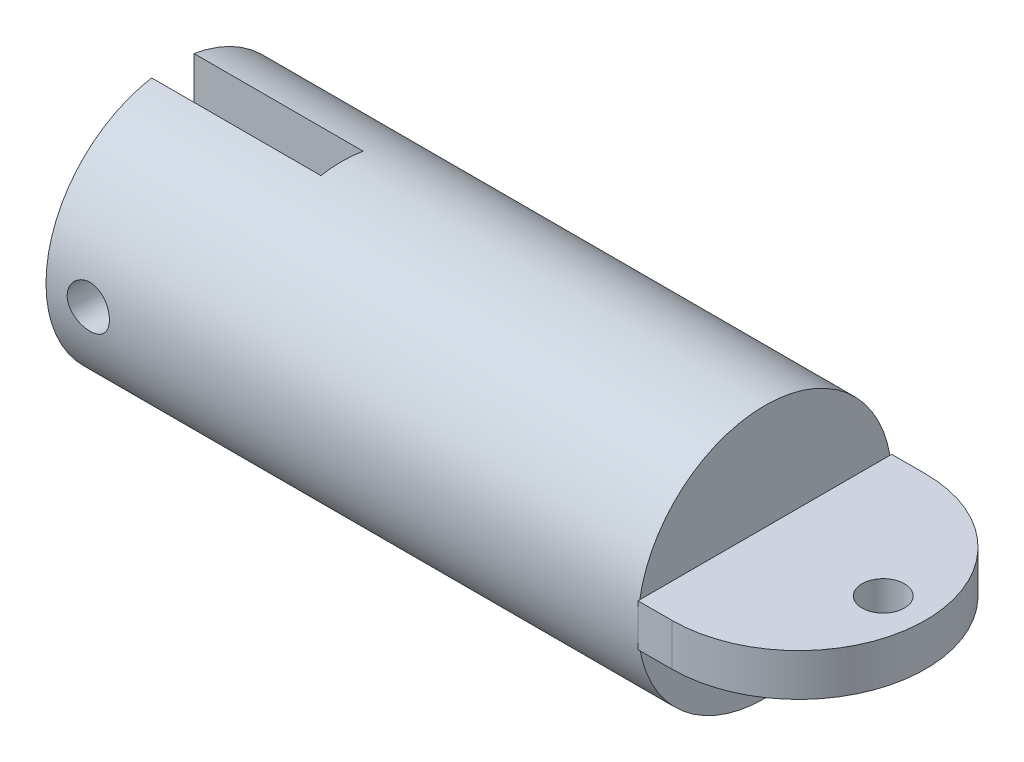
ISO-10303-21;
HEADER;
FILE_DESCRIPTION(('STEP AP214'),'2;1');
FILE_NAME('part.step','',(''),(''),'','','');
FILE_SCHEMA(('AUTOMOTIVE_DESIGN { 1 0 10303 214 1 1 1 1 }'));
ENDSEC;
DATA;
#1=APPLICATION_CONTEXT('core data for automotive mechanical design processes');
#2=APPLICATION_PROTOCOL_DEFINITION('international standard','automotive_design',2000,#1);
#3=PRODUCT_CONTEXT('',#1,'mechanical');
#4=PRODUCT('Part','Part','',(#3));
#5=PRODUCT_RELATED_PRODUCT_CATEGORY('part','',(#4));
#6=PRODUCT_DEFINITION_FORMATION('','',#4);
#7=PRODUCT_DEFINITION_CONTEXT('part definition',#1,'design');
#8=PRODUCT_DEFINITION('design','',#6,#7);
#9=PRODUCT_DEFINITION_SHAPE('','',#8);
#10=(LENGTH_UNIT() NAMED_UNIT(*) SI_UNIT(.MILLI.,.METRE.));
#11=(NAMED_UNIT(*) PLANE_ANGLE_UNIT() SI_UNIT($,.RADIAN.));
#12=(NAMED_UNIT(*) SI_UNIT($,.STERADIAN.) SOLID_ANGLE_UNIT());
#13=UNCERTAINTY_MEASURE_WITH_UNIT(LENGTH_MEASURE(1.E-05),#10,'distance_accuracy_value','');
#14=(GEOMETRIC_REPRESENTATION_CONTEXT(3) GLOBAL_UNCERTAINTY_ASSIGNED_CONTEXT((#13)) GLOBAL_UNIT_ASSIGNED_CONTEXT((#10,
#11,#12)) REPRESENTATION_CONTEXT('',''));
#15=CARTESIAN_POINT('',(0.,0.,0.));
#16=DIRECTION('',(0.,0.,1.));
#17=DIRECTION('',(1.,0.,0.));
#18=AXIS2_PLACEMENT_3D('',#15,#16,#17);
#19=CARTESIAN_POINT('',(0.,0.,0.));
#20=DIRECTION('',(1.,0.,0.));
#21=DIRECTION('',(0.,0.,-1.));
#22=AXIS2_PLACEMENT_3D('',#19,#20,#21);
#23=PLANE('',#22);
#24=DIRECTION('',(0.,0.,1.));
#25=VECTOR('',#24,1.);
#26=CARTESIAN_POINT('',(0.,2.5,15.));
#27=LINE('',#26,#25);
#28=CARTESIAN_POINT('',(0.,2.5,-14.790199457749));
#29=VERTEX_POINT('',#28);
#30=CARTESIAN_POINT('',(0.,2.5,14.790199457749));
#31=VERTEX_POINT('',#30);
#32=EDGE_CURVE('E11',#29,#31,#27,.T.);
#33=ORIENTED_EDGE('',*,*,#32,.F.);
#34=CARTESIAN_POINT('',(0.,0.,0.));
#35=DIRECTION('',(1.,0.,0.));
#36=DIRECTION('',(0.,0.,-1.));
#37=AXIS2_PLACEMENT_3D('',#34,#35,#36);
#38=CIRCLE('',#37,15.);
#39=EDGE_CURVE('E229',#29,#31,#38,.T.);
#40=ORIENTED_EDGE('',*,*,#39,.T.);
#41=EDGE_LOOP('',(#33,#40));
#42=FACE_BOUND('',#41,.T.);
#43=ADVANCED_FACE('F37',(#42),#23,.T.);
#44=CARTESIAN_POINT('',(-70.,0.,0.));
#45=DIRECTION('',(1.,0.,0.));
#46=DIRECTION('',(0.,0.,-1.));
#47=AXIS2_PLACEMENT_3D('',#44,#45,#46);
#48=PLANE('',#47);
#49=CARTESIAN_POINT('',(-70.,0.,0.));
#50=DIRECTION('',(1.,0.,0.));
#51=DIRECTION('',(0.,0.,-1.));
#52=AXIS2_PLACEMENT_3D('',#49,#50,#51);
#53=CIRCLE('',#52,15.);
#54=CARTESIAN_POINT('',(-70.,-14.790199457749,-2.5));
#55=VERTEX_POINT('',#54);
#56=CARTESIAN_POINT('',(-70.,14.790199457749,-2.5));
#57=VERTEX_POINT('',#56);
#58=EDGE_CURVE('E242',#55,#57,#53,.T.);
#59=ORIENTED_EDGE('',*,*,#58,.F.);
#60=DIRECTION('',(0.,1.,0.));
#61=VECTOR('',#60,1.);
#62=CARTESIAN_POINT('',(-70.,0.,-2.5));
#63=LINE('',#62,#61);
#64=EDGE_CURVE('E258',#55,#57,#63,.T.);
#65=ORIENTED_EDGE('',*,*,#64,.T.);
#66=EDGE_LOOP('',(#59,#65));
#67=FACE_BOUND('',#66,.T.);
#68=ADVANCED_FACE('F217',(#67),#48,.F.);
#69=CARTESIAN_POINT('',(-70.,0.,0.));
#70=DIRECTION('',(1.,0.,0.));
#71=DIRECTION('',(0.,0.,-1.));
#72=AXIS2_PLACEMENT_3D('',#69,#70,#71);
#73=CYLINDRICAL_SURFACE('',#72,15.);
#74=CARTESIAN_POINT('',(-62.5,0.,-15.));
#75=CARTESIAN_POINT('',(-62.5000055889478,-0.139390904958215,-14.9999976116882));
#76=CARTESIAN_POINT('',(-62.5116972749689,-0.278857881838821,-14.9980367791303));
#77=CARTESIAN_POINT('',(-62.5581356587653,-0.553880221673042,-14.9904034494139));
#78=CARTESIAN_POINT('',(-62.5929035569116,-0.689431867959245,-14.9847275392389));
#79=CARTESIAN_POINT('',(-62.6844154485928,-0.952604747212643,-14.9703006823645));
#80=CARTESIAN_POINT('',(-62.7411414656406,-1.0802323684319,-14.9615522515919));
#81=CARTESIAN_POINT('',(-62.8749122920524,-1.32414184197795,-14.9419422708207));
#82=CARTESIAN_POINT('',(-62.951954777483,-1.44042498987859,-14.9310809625443));
#83=CARTESIAN_POINT('',(-63.1249550838205,-1.65947261429168,-14.9083331745831));
#84=CARTESIAN_POINT('',(-63.2210691146361,-1.76211290353497,-14.8964387181486));
#85=CARTESIAN_POINT('',(-63.4291479684728,-1.94988849865993,-14.8730262687673));
#86=CARTESIAN_POINT('',(-63.5411137914566,-2.03502269939097,-14.8615082996267));
#87=CARTESIAN_POINT('',(-63.7785709661971,-2.18586712560513,-14.8400756575978));
#88=CARTESIAN_POINT('',(-63.9041413368047,-2.25145455286099,-14.8301712909164));
#89=CARTESIAN_POINT('',(-64.1647095643006,-2.36055836541121,-14.8131978979467));
#90=CARTESIAN_POINT('',(-64.2997067836776,-2.40407624156561,-14.8061286801431));
#91=CARTESIAN_POINT('',(-64.5739802748565,-2.4674143777848,-14.7957053684276));
#92=CARTESIAN_POINT('',(-64.7132057365014,-2.4874490291354,-14.792317684857));
#93=CARTESIAN_POINT('',(-64.9930802768835,-2.50391672528987,-14.7895393893665));
#94=CARTESIAN_POINT('',(-65.1337292541673,-2.50035144038899,-14.7901484945721));
#95=CARTESIAN_POINT('',(-65.4109278612755,-2.46989509839615,-14.7952642886356));
#96=CARTESIAN_POINT('',(-65.5475048035452,-2.44324488188977,-14.7997307331892));
#97=CARTESIAN_POINT('',(-65.8142213178291,-2.36775314040344,-14.8119949521101));
#98=CARTESIAN_POINT('',(-65.9443606688885,-2.31891085431974,-14.8197928407327));
#99=CARTESIAN_POINT('',(-66.1952288234409,-2.20017724609391,-14.837884793341));
#100=CARTESIAN_POINT('',(-66.3159094060812,-2.13018591387971,-14.8481906710733));
#101=CARTESIAN_POINT('',(-66.5439044005384,-1.97121201755744,-14.8701291841501));
#102=CARTESIAN_POINT('',(-66.6512177324549,-1.88222792065429,-14.8817619265429));
#103=CARTESIAN_POINT('',(-66.8508260858074,-1.68648221215905,-14.9052202787979));
#104=CARTESIAN_POINT('',(-66.9429185185401,-1.57951396387312,-14.9170464923165));
#105=CARTESIAN_POINT('',(-67.1078777626653,-1.35153524898164,-14.9394260139672));
#106=CARTESIAN_POINT('',(-67.1807444501832,-1.23052469190642,-14.9499793138975));
#107=CARTESIAN_POINT('',(-67.3052022271363,-0.977705916166705,-14.9686389289291));
#108=CARTESIAN_POINT('',(-67.3567754193313,-0.845888725564656,-14.9767431840745));
#109=CARTESIAN_POINT('',(-67.436994215246,-0.575298345602725,-14.9895750301266));
#110=CARTESIAN_POINT('',(-67.4656417369737,-0.43652573917946,-14.9943029035047));
#111=CARTESIAN_POINT('',(-67.4989213584611,-0.157709901301616,-14.9998112984269));
#112=CARTESIAN_POINT('',(-67.5038315718056,-0.017700737151005,-15.0006375301278));
#113=CARTESIAN_POINT('',(-67.4902386555719,0.261139772889892,-14.9983747442117));
#114=CARTESIAN_POINT('',(-67.4717364268663,0.399971163892043,-14.9952858772412));
#115=CARTESIAN_POINT('',(-67.4120751506645,0.671656175546764,-14.985568269382));
#116=CARTESIAN_POINT('',(-67.3710537916099,0.804540868385377,-14.9789610480131));
#117=CARTESIAN_POINT('',(-67.2676654818005,1.06154688486044,-14.9629446445536));
#118=CARTESIAN_POINT('',(-67.2052973323647,1.18566771590972,-14.9535353051202));
#119=CARTESIAN_POINT('',(-67.0603488753032,1.42283068946896,-14.9328451630241));
#120=CARTESIAN_POINT('',(-66.9775948438328,1.53576525093715,-14.9215485588702));
#121=CARTESIAN_POINT('',(-66.7944626846149,1.74624358550269,-14.898384673919));
#122=CARTESIAN_POINT('',(-66.6940832767233,1.84378623969658,-14.8865173517155));
#123=CARTESIAN_POINT('',(-66.4773024519286,2.021742779658,-14.8634017523585));
#124=CARTESIAN_POINT('',(-66.3607458344856,2.10196876111371,-14.8521611613711));
#125=CARTESIAN_POINT('',(-66.1156470308615,2.24170231029498,-14.8317152977788));
#126=CARTESIAN_POINT('',(-65.9871052247725,2.30121053476982,-14.8225099606602));
#127=CARTESIAN_POINT('',(-65.7222102671879,2.39753833147314,-14.807234536977));
#128=CARTESIAN_POINT('',(-65.5858919049695,2.43445143254794,-14.8011515431106));
#129=CARTESIAN_POINT('',(-65.3088798707782,2.48483545377827,-14.7927771683526));
#130=CARTESIAN_POINT('',(-65.1681865802679,2.49830841194616,-14.7904854578272));
#131=CARTESIAN_POINT('',(-64.8882948340376,2.50137286604735,-14.7899673308401));
#132=CARTESIAN_POINT('',(-64.7490996214247,2.49126013612518,-14.7916905650565));
#133=CARTESIAN_POINT('',(-64.4744207519492,2.44807983895684,-14.7988978145373));
#134=CARTESIAN_POINT('',(-64.3389370830581,2.41501234611247,-14.8043818176121));
#135=CARTESIAN_POINT('',(-64.0756415627074,2.32697448959489,-14.8184735628172));
#136=CARTESIAN_POINT('',(-63.947820989944,2.27202959060044,-14.8270776721967));
#137=CARTESIAN_POINT('',(-63.7031643308052,2.1418270039159,-14.8464436892221));
#138=CARTESIAN_POINT('',(-63.5863287896279,2.06656830874855,-14.857205703884));
#139=CARTESIAN_POINT('',(-63.3654644168922,1.89681888437215,-14.8798345404562));
#140=CARTESIAN_POINT('',(-63.2616039832997,1.80211056359364,-14.891712955763));
#141=CARTESIAN_POINT('',(-63.0711483955251,1.59660903138022,-14.9151437236084));
#142=CARTESIAN_POINT('',(-62.9845572313618,1.48581211291263,-14.9266960002655));
#143=CARTESIAN_POINT('',(-62.8305517318,1.25036916964028,-14.9482652964222));
#144=CARTESIAN_POINT('',(-62.7632739606871,1.12563278753281,-14.958271162531));
#145=CARTESIAN_POINT('',(-62.6507305153901,0.866513069378975,-14.9755116760178));
#146=CARTESIAN_POINT('',(-62.6054429189203,0.732139494830001,-14.9827490817748));
#147=CARTESIAN_POINT('',(-62.5479947258733,0.497703310045392,-14.9920579083296));
#148=CARTESIAN_POINT('',(-62.530025530384,0.399058830298441,-14.9950202727336));
#149=CARTESIAN_POINT('',(-62.5060262621552,0.200289310319806,-14.9989921598612));
#150=CARTESIAN_POINT('',(-62.4999959838626,0.100164295608492,-15.0000017162064));
#151=CARTESIAN_POINT('',(-62.5,0.,-15.));
#152=B_SPLINE_CURVE_WITH_KNOTS('',3,(#74,#75,#76,#77,#78,#79,#80,#81,#82,#83,#84,#85,#86,#87,
#88,#89,#90,#91,#92,#93,#94,#95,#96,#97,#98,#99,#100,#101,#102,#103,#104,#105,#106,#107,#108,
#109,#110,#111,#112,#113,#114,#115,#116,#117,#118,#119,#120,#121,#122,#123,#124,#125,#126,#127,
#128,#129,#130,#131,#132,#133,#134,#135,#136,#137,#138,#139,#140,#141,#142,#143,#144,#145,#146,
#147,#148,#149,#150,#151),.UNSPECIFIED.,.T.,.F.,(4,2,2,2,2,2,2,2,2,2,2,2,2,2,2,2,2,2,2,2,2,2,2,
2,2,2,2,2,2,2,2,2,2,2,2,2,2,2,4),(0.,0.417806584938509,0.835997545695422,1.25384686702527,
1.67164841267479,2.09302491062332,2.51442800169857,2.93842520823838,3.36239376876182,
3.78246077103422,4.20249804320885,4.61820521760407,5.0339266502538,5.45164556632556,
5.86939820680572,6.29232769911327,6.71525991635847,7.13854688915903,7.56179844521148,
7.98007883491396,8.39834313035859,8.81407807006414,9.22983635826065,9.64926825627023,
10.0687306305428,10.4925382200762,10.9163323737594,11.3383602234177,11.7603513778662,
12.177079095227,12.5938054618813,13.0100481822622,13.4263115502933,13.8475138419339,
14.2688133387897,14.693022316072,15.1168075213007,15.4170424816402,15.7172722727697),.UNSPECIFIED.);
#153=CARTESIAN_POINT('',(-62.5,0.,-15.));
#154=VERTEX_POINT('',#153);
#155=EDGE_CURVE('E185',#154,#154,#152,.T.);
#156=ORIENTED_EDGE('',*,*,#155,.F.);
#157=EDGE_LOOP('',(#156));
#158=FACE_BOUND('',#157,.T.);
#159=CARTESIAN_POINT('',(-62.5,0.,15.));
#160=CARTESIAN_POINT('',(-62.5000055889478,0.139390904958215,14.9999976116882));
#161=CARTESIAN_POINT('',(-62.5116972749689,0.278857881838821,14.9980367791303));
#162=CARTESIAN_POINT('',(-62.5581356587653,0.553880221673042,14.9904034494139));
#163=CARTESIAN_POINT('',(-62.5929035569116,0.689431867959245,14.9847275392389));
#164=CARTESIAN_POINT('',(-62.6844154485928,0.952604747212643,14.9703006823645));
#165=CARTESIAN_POINT('',(-62.7411414656406,1.0802323684319,14.9615522515919));
#166=CARTESIAN_POINT('',(-62.8749122920524,1.32414184197795,14.9419422708207));
#167=CARTESIAN_POINT('',(-62.951954777483,1.44042498987859,14.9310809625443));
#168=CARTESIAN_POINT('',(-63.1249550838205,1.65947261429168,14.9083331745831));
#169=CARTESIAN_POINT('',(-63.2210691146361,1.76211290353497,14.8964387181486));
#170=CARTESIAN_POINT('',(-63.4291479684728,1.94988849865993,14.8730262687673));
#171=CARTESIAN_POINT('',(-63.5411137914566,2.03502269939097,14.8615082996267));
#172=CARTESIAN_POINT('',(-63.7785709661971,2.18586712560513,14.8400756575978));
#173=CARTESIAN_POINT('',(-63.9041413368047,2.25145455286099,14.8301712909164));
#174=CARTESIAN_POINT('',(-64.1647095643006,2.36055836541121,14.8131978979467));
#175=CARTESIAN_POINT('',(-64.2997067836776,2.40407624156561,14.8061286801431));
#176=CARTESIAN_POINT('',(-64.5739802748565,2.4674143777848,14.7957053684276));
#177=CARTESIAN_POINT('',(-64.7132057365014,2.4874490291354,14.792317684857));
#178=CARTESIAN_POINT('',(-64.9930802768835,2.50391672528987,14.7895393893665));
#179=CARTESIAN_POINT('',(-65.1337292541673,2.50035144038899,14.7901484945721));
#180=CARTESIAN_POINT('',(-65.4109278612755,2.46989509839615,14.7952642886356));
#181=CARTESIAN_POINT('',(-65.5475048035452,2.44324488188977,14.7997307331892));
#182=CARTESIAN_POINT('',(-65.8142213178291,2.36775314040344,14.8119949521101));
#183=CARTESIAN_POINT('',(-65.9443606688885,2.31891085431974,14.8197928407327));
#184=CARTESIAN_POINT('',(-66.1952288234409,2.20017724609391,14.837884793341));
#185=CARTESIAN_POINT('',(-66.3159094060812,2.13018591387971,14.8481906710733));
#186=CARTESIAN_POINT('',(-66.5439044005384,1.97121201755744,14.8701291841501));
#187=CARTESIAN_POINT('',(-66.6512177324549,1.88222792065429,14.8817619265429));
#188=CARTESIAN_POINT('',(-66.8508260858074,1.68648221215905,14.9052202787979));
#189=CARTESIAN_POINT('',(-66.9429185185401,1.57951396387312,14.9170464923165));
#190=CARTESIAN_POINT('',(-67.1078777626653,1.35153524898164,14.9394260139672));
#191=CARTESIAN_POINT('',(-67.1807444501832,1.23052469190642,14.9499793138975));
#192=CARTESIAN_POINT('',(-67.3052022271363,0.977705916166705,14.9686389289291));
#193=CARTESIAN_POINT('',(-67.3567754193313,0.845888725564656,14.9767431840745));
#194=CARTESIAN_POINT('',(-67.436994215246,0.575298345602725,14.9895750301266));
#195=CARTESIAN_POINT('',(-67.4656417369737,0.43652573917946,14.9943029035047));
#196=CARTESIAN_POINT('',(-67.4989213584611,0.157709901301616,14.9998112984269));
#197=CARTESIAN_POINT('',(-67.5038315718056,0.017700737151005,15.0006375301278));
#198=CARTESIAN_POINT('',(-67.4902386555719,-0.261139772889892,14.9983747442117));
#199=CARTESIAN_POINT('',(-67.4717364268663,-0.399971163892043,14.9952858772412));
#200=CARTESIAN_POINT('',(-67.4120751506645,-0.671656175546764,14.985568269382));
#201=CARTESIAN_POINT('',(-67.3710537916099,-0.804540868385377,14.9789610480131));
#202=CARTESIAN_POINT('',(-67.2676654818005,-1.06154688486044,14.9629446445536));
#203=CARTESIAN_POINT('',(-67.2052973323647,-1.18566771590972,14.9535353051202));
#204=CARTESIAN_POINT('',(-67.0603488753032,-1.42283068946896,14.9328451630241));
#205=CARTESIAN_POINT('',(-66.9775948438328,-1.53576525093715,14.9215485588702));
#206=CARTESIAN_POINT('',(-66.7944626846149,-1.74624358550269,14.898384673919));
#207=CARTESIAN_POINT('',(-66.6940832767233,-1.84378623969658,14.8865173517155));
#208=CARTESIAN_POINT('',(-66.4773024519286,-2.021742779658,14.8634017523585));
#209=CARTESIAN_POINT('',(-66.3607458344856,-2.10196876111371,14.8521611613711));
#210=CARTESIAN_POINT('',(-66.1156470308615,-2.24170231029498,14.8317152977788));
#211=CARTESIAN_POINT('',(-65.9871052247725,-2.30121053476982,14.8225099606602));
#212=CARTESIAN_POINT('',(-65.7222102671879,-2.39753833147314,14.807234536977));
#213=CARTESIAN_POINT('',(-65.5858919049695,-2.43445143254794,14.8011515431106));
#214=CARTESIAN_POINT('',(-65.3088798707782,-2.48483545377827,14.7927771683526));
#215=CARTESIAN_POINT('',(-65.1681865802679,-2.49830841194616,14.7904854578272));
#216=CARTESIAN_POINT('',(-64.8882948340376,-2.50137286604735,14.7899673308401));
#217=CARTESIAN_POINT('',(-64.7490996214247,-2.49126013612518,14.7916905650565));
#218=CARTESIAN_POINT('',(-64.4744207519492,-2.44807983895684,14.7988978145373));
#219=CARTESIAN_POINT('',(-64.3389370830581,-2.41501234611247,14.8043818176121));
#220=CARTESIAN_POINT('',(-64.0756415627074,-2.32697448959489,14.8184735628172));
#221=CARTESIAN_POINT('',(-63.947820989944,-2.27202959060044,14.8270776721967));
#222=CARTESIAN_POINT('',(-63.7031643308052,-2.1418270039159,14.8464436892221));
#223=CARTESIAN_POINT('',(-63.5863287896279,-2.06656830874855,14.857205703884));
#224=CARTESIAN_POINT('',(-63.3654644168922,-1.89681888437215,14.8798345404562));
#225=CARTESIAN_POINT('',(-63.2616039832997,-1.80211056359364,14.891712955763));
#226=CARTESIAN_POINT('',(-63.0711483955251,-1.59660903138022,14.9151437236084));
#227=CARTESIAN_POINT('',(-62.9845572313618,-1.48581211291263,14.9266960002655));
#228=CARTESIAN_POINT('',(-62.8305517318,-1.25036916964028,14.9482652964222));
#229=CARTESIAN_POINT('',(-62.7632739606871,-1.12563278753281,14.958271162531));
#230=CARTESIAN_POINT('',(-62.6507305153901,-0.866513069378975,14.9755116760178));
#231=CARTESIAN_POINT('',(-62.6054429189203,-0.732139494830001,14.9827490817748));
#232=CARTESIAN_POINT('',(-62.5479947258733,-0.497703310045392,14.9920579083296));
#233=CARTESIAN_POINT('',(-62.530025530384,-0.399058830298441,14.9950202727336));
#234=CARTESIAN_POINT('',(-62.5060262621552,-0.200289310319806,14.9989921598612));
#235=CARTESIAN_POINT('',(-62.4999959838626,-0.100164295608492,15.0000017162064));
#236=CARTESIAN_POINT('',(-62.5,0.,15.));
#237=B_SPLINE_CURVE_WITH_KNOTS('',3,(#159,#160,#161,#162,#163,#164,#165,#166,#167,#168,#169,
#170,#171,#172,#173,#174,#175,#176,#177,#178,#179,#180,#181,#182,#183,#184,#185,#186,#187,#188,
#189,#190,#191,#192,#193,#194,#195,#196,#197,#198,#199,#200,#201,#202,#203,#204,#205,#206,#207,
#208,#209,#210,#211,#212,#213,#214,#215,#216,#217,#218,#219,#220,#221,#222,#223,#224,#225,#226,
#227,#228,#229,#230,#231,#232,#233,#234,#235,#236),.UNSPECIFIED.,.T.,.F.,(4,2,2,2,2,2,2,2,2,2,2,
2,2,2,2,2,2,2,2,2,2,2,2,2,2,2,2,2,2,2,2,2,2,2,2,2,2,2,4),(0.,0.417806584938509,
0.835997545695422,1.25384686702527,1.67164841267479,2.09302491062332,2.51442800169857,
2.93842520823838,3.36239376876182,3.78246077103422,4.20249804320885,4.61820521760407,
5.0339266502538,5.45164556632556,5.86939820680572,6.29232769911327,6.71525991635847,
7.13854688915903,7.56179844521148,7.98007883491396,8.39834313035859,8.81407807006414,
9.22983635826065,9.64926825627023,10.0687306305428,10.4925382200762,10.9163323737594,
11.3383602234177,11.7603513778662,12.177079095227,12.5938054618813,13.0100481822622,
13.4263115502933,13.8475138419339,14.2688133387897,14.693022316072,15.1168075213007,
15.4170424816402,15.7172722727697),.UNSPECIFIED.);
#238=CARTESIAN_POINT('',(-62.5,0.,15.));
#239=VERTEX_POINT('',#238);
#240=EDGE_CURVE('E178',#239,#239,#237,.T.);
#241=ORIENTED_EDGE('',*,*,#240,.F.);
#242=EDGE_LOOP('',(#241));
#243=FACE_BOUND('',#242,.T.);
#244=DIRECTION('',(1.,0.,0.));
#245=VECTOR('',#244,1.);
#246=CARTESIAN_POINT('',(-70.,-14.790199457749,-2.5));
#247=LINE('',#246,#245);
#248=CARTESIAN_POINT('',(-50.,-14.790199457749,-2.5));
#249=VERTEX_POINT('',#248);
#250=EDGE_CURVE('E280',#55,#249,#247,.T.);
#251=ORIENTED_EDGE('',*,*,#250,.F.);
#252=ORIENTED_EDGE('',*,*,#58,.T.);
#253=DIRECTION('',(1.,0.,0.));
#254=VECTOR('',#253,1.);
#255=CARTESIAN_POINT('',(-70.,14.790199457749,-2.5));
#256=LINE('',#255,#254);
#257=CARTESIAN_POINT('',(-50.,14.790199457749,-2.5));
#258=VERTEX_POINT('',#257);
#259=EDGE_CURVE('E287',#258,#57,#256,.F.);
#260=ORIENTED_EDGE('',*,*,#259,.F.);
#261=CARTESIAN_POINT('',(-50.,0.,0.));
#262=DIRECTION('',(1.,0.,0.));
#263=DIRECTION('',(0.,0.,-1.));
#264=AXIS2_PLACEMENT_3D('',#261,#262,#263);
#265=CIRCLE('',#264,15.);
#266=CARTESIAN_POINT('',(-50.,14.790199457749,2.5));
#267=VERTEX_POINT('',#266);
#268=EDGE_CURVE('E262',#267,#258,#265,.F.);
#269=ORIENTED_EDGE('',*,*,#268,.F.);
#270=DIRECTION('',(1.,0.,0.));
#271=VECTOR('',#270,1.);
#272=CARTESIAN_POINT('',(-70.,14.790199457749,2.5));
#273=LINE('',#272,#271);
#274=CARTESIAN_POINT('',(-70.,14.790199457749,2.5));
#275=VERTEX_POINT('',#274);
#276=EDGE_CURVE('E294',#275,#267,#273,.T.);
#277=ORIENTED_EDGE('',*,*,#276,.F.);
#278=CARTESIAN_POINT('',(-70.,-14.790199457749,2.5));
#279=VERTEX_POINT('',#278);
#280=EDGE_CURVE('E259',#275,#279,#53,.T.);
#281=ORIENTED_EDGE('',*,*,#280,.T.);
#282=DIRECTION('',(1.,0.,0.));
#283=VECTOR('',#282,1.);
#284=CARTESIAN_POINT('',(-70.,-14.790199457749,2.5));
#285=LINE('',#284,#283);
#286=CARTESIAN_POINT('',(-50.,-14.790199457749,2.5));
#287=VERTEX_POINT('',#286);
#288=EDGE_CURVE('E288',#287,#279,#285,.F.);
#289=ORIENTED_EDGE('',*,*,#288,.F.);
#290=EDGE_CURVE('E263',#249,#287,#265,.F.);
#291=ORIENTED_EDGE('',*,*,#290,.F.);
#292=EDGE_LOOP('',(#251,#252,#260,#269,#277,#281,#289,#291));
#293=FACE_BOUND('',#292,.T.);
#294=CARTESIAN_POINT('',(0.,0.,-15.));
#295=VERTEX_POINT('',#294);
#296=EDGE_CURVE('E234',#295,#29,#38,.T.);
#297=ORIENTED_EDGE('',*,*,#296,.F.);
#298=CARTESIAN_POINT('',(0.,-2.5,-14.790199457749));
#299=VERTEX_POINT('',#298);
#300=EDGE_CURVE('E243',#299,#295,#38,.T.);
#301=ORIENTED_EDGE('',*,*,#300,.F.);
#302=CARTESIAN_POINT('',(0.,-2.5,14.790199457749));
#303=VERTEX_POINT('',#302);
#304=EDGE_CURVE('E251',#303,#299,#38,.T.);
#305=ORIENTED_EDGE('',*,*,#304,.F.);
#306=CARTESIAN_POINT('',(0.,0.,15.));
#307=VERTEX_POINT('',#306);
#308=EDGE_CURVE('E62',#307,#303,#38,.T.);
#309=ORIENTED_EDGE('',*,*,#308,.F.);
#310=EDGE_CURVE('E236',#31,#307,#38,.T.);
#311=ORIENTED_EDGE('',*,*,#310,.F.);
#312=ORIENTED_EDGE('',*,*,#39,.F.);
#313=EDGE_LOOP('',(#297,#301,#305,#309,#311,#312));
#314=FACE_BOUND('',#313,.T.);
#315=ADVANCED_FACE('F39',(#158,#243,#293,#314),#73,.T.);
#316=ORIENTED_EDGE('',*,*,#280,.F.);
#317=DIRECTION('',(0.,-1.,0.));
#318=VECTOR('',#317,1.);
#319=CARTESIAN_POINT('',(-70.,0.,2.5));
#320=LINE('',#319,#318);
#321=EDGE_CURVE('E255',#275,#279,#320,.T.);
#322=ORIENTED_EDGE('',*,*,#321,.T.);
#323=EDGE_LOOP('',(#316,#322));
#324=FACE_BOUND('',#323,.T.);
#325=ADVANCED_FACE('F214',(#324),#48,.F.);
#326=DIRECTION('',(0.,0.,-1.));
#327=VECTOR('',#326,1.);
#328=CARTESIAN_POINT('',(0.,-2.5,15.));
#329=LINE('',#328,#327);
#330=EDGE_CURVE('E47',#303,#299,#329,.T.);
#331=ORIENTED_EDGE('',*,*,#330,.F.);
#332=ORIENTED_EDGE('',*,*,#304,.T.);
#333=EDGE_LOOP('',(#331,#332));
#334=FACE_BOUND('',#333,.T.);
#335=ADVANCED_FACE('F205',(#334),#23,.T.);
#336=CARTESIAN_POINT('',(-70.,-15.,-2.5));
#337=DIRECTION('',(0.,0.,-1.));
#338=DIRECTION('',(-1.,0.,0.));
#339=AXIS2_PLACEMENT_3D('',#336,#337,#338);
#340=PLANE('',#339);
#341=CARTESIAN_POINT('',(-65.,0.,-2.5));
#342=DIRECTION('',(0.,0.,-1.));
#343=DIRECTION('',(-1.,0.,0.));
#344=AXIS2_PLACEMENT_3D('',#341,#342,#343);
#345=CIRCLE('',#344,2.5);
#346=CARTESIAN_POINT('',(-67.5,0.,-2.5));
#347=VERTEX_POINT('',#346);
#348=EDGE_CURVE('E175',#347,#347,#345,.T.);
#349=ORIENTED_EDGE('',*,*,#348,.T.);
#350=EDGE_LOOP('',(#349));
#351=FACE_BOUND('',#350,.T.);
#352=ORIENTED_EDGE('',*,*,#259,.T.);
#353=ORIENTED_EDGE('',*,*,#64,.F.);
#354=ORIENTED_EDGE('',*,*,#250,.T.);
#355=DIRECTION('',(0.,1.,0.));
#356=VECTOR('',#355,1.);
#357=CARTESIAN_POINT('',(-50.,-15.,-2.5));
#358=LINE('',#357,#356);
#359=EDGE_CURVE('E299',#249,#258,#358,.T.);
#360=ORIENTED_EDGE('',*,*,#359,.T.);
#361=EDGE_LOOP('',(#352,#353,#354,#360));
#362=FACE_BOUND('',#361,.T.);
#363=ADVANCED_FACE('F200',(#351,#362),#340,.F.);
#364=CARTESIAN_POINT('',(-50.,-15.,-2.5));
#365=DIRECTION('',(1.,0.,0.));
#366=DIRECTION('',(0.,0.,-1.));
#367=AXIS2_PLACEMENT_3D('',#364,#365,#366);
#368=PLANE('',#367);
#369=ORIENTED_EDGE('',*,*,#359,.F.);
#370=ORIENTED_EDGE('',*,*,#290,.T.);
#371=DIRECTION('',(0.,1.,0.));
#372=VECTOR('',#371,1.);
#373=CARTESIAN_POINT('',(-50.,-15.,2.5));
#374=LINE('',#373,#372);
#375=EDGE_CURVE('E297',#287,#267,#374,.T.);
#376=ORIENTED_EDGE('',*,*,#375,.T.);
#377=ORIENTED_EDGE('',*,*,#268,.T.);
#378=EDGE_LOOP('',(#369,#370,#376,#377));
#379=FACE_BOUND('',#378,.T.);
#380=ADVANCED_FACE('F204',(#379),#368,.F.);
#381=CARTESIAN_POINT('',(-70.,-15.,2.5));
#382=DIRECTION('',(0.,0.,1.));
#383=DIRECTION('',(1.,0.,0.));
#384=AXIS2_PLACEMENT_3D('',#381,#382,#383);
#385=PLANE('',#384);
#386=CARTESIAN_POINT('',(-65.,0.,2.5));
#387=DIRECTION('',(0.,0.,1.));
#388=DIRECTION('',(1.,0.,0.));
#389=AXIS2_PLACEMENT_3D('',#386,#387,#388);
#390=CIRCLE('',#389,2.5);
#391=CARTESIAN_POINT('',(-62.5,0.,2.5));
#392=VERTEX_POINT('',#391);
#393=EDGE_CURVE('E174',#392,#392,#390,.T.);
#394=ORIENTED_EDGE('',*,*,#393,.T.);
#395=EDGE_LOOP('',(#394));
#396=FACE_BOUND('',#395,.T.);
#397=ORIENTED_EDGE('',*,*,#288,.T.);
#398=ORIENTED_EDGE('',*,*,#321,.F.);
#399=ORIENTED_EDGE('',*,*,#276,.T.);
#400=ORIENTED_EDGE('',*,*,#375,.F.);
#401=EDGE_LOOP('',(#397,#398,#399,#400));
#402=FACE_BOUND('',#401,.T.);
#403=ADVANCED_FACE('F209',(#396,#402),#385,.F.);
#404=CARTESIAN_POINT('',(-65.,0.,-15.));
#405=DIRECTION('',(0.,0.,1.));
#406=DIRECTION('',(1.,0.,0.));
#407=AXIS2_PLACEMENT_3D('',#404,#405,#406);
#408=CYLINDRICAL_SURFACE('',#407,2.5);
#409=ORIENTED_EDGE('',*,*,#240,.T.);
#410=EDGE_LOOP('',(#409));
#411=FACE_BOUND('',#410,.T.);
#412=ORIENTED_EDGE('',*,*,#393,.F.);
#413=EDGE_LOOP('',(#412));
#414=FACE_BOUND('',#413,.T.);
#415=ADVANCED_FACE('F196',(#411,#414),#408,.F.);
#416=ORIENTED_EDGE('',*,*,#155,.T.);
#417=EDGE_LOOP('',(#416));
#418=FACE_BOUND('',#417,.T.);
#419=ORIENTED_EDGE('',*,*,#348,.F.);
#420=EDGE_LOOP('',(#419));
#421=FACE_BOUND('',#420,.T.);
#422=ADVANCED_FACE('F190',(#418,#421),#408,.F.);
#423=CARTESIAN_POINT('',(0.,0.,0.));
#424=DIRECTION('',(-1.,0.,0.));
#425=DIRECTION('',(0.,0.,1.));
#426=AXIS2_PLACEMENT_3D('',#423,#424,#425);
#427=PLANE('',#426);
#428=CARTESIAN_POINT('',(0.,2.5,15.));
#429=VERTEX_POINT('',#428);
#430=EDGE_CURVE('E50',#31,#429,#27,.T.);
#431=ORIENTED_EDGE('',*,*,#430,.F.);
#432=ORIENTED_EDGE('',*,*,#310,.T.);
#433=DIRECTION('',(0.,-1.,0.));
#434=VECTOR('',#433,1.);
#435=CARTESIAN_POINT('',(0.,-2.5,15.));
#436=LINE('',#435,#434);
#437=EDGE_CURVE('E161',#429,#307,#436,.T.);
#438=ORIENTED_EDGE('',*,*,#437,.F.);
#439=EDGE_LOOP('',(#431,#432,#438));
#440=FACE_BOUND('',#439,.T.);
#441=ADVANCED_FACE('F195',(#440),#427,.T.);
#442=CARTESIAN_POINT('',(0.,-2.5,15.));
#443=VERTEX_POINT('',#442);
#444=EDGE_CURVE('E155',#307,#443,#436,.T.);
#445=ORIENTED_EDGE('',*,*,#444,.F.);
#446=ORIENTED_EDGE('',*,*,#308,.T.);
#447=EDGE_CURVE('E164',#443,#303,#329,.T.);
#448=ORIENTED_EDGE('',*,*,#447,.F.);
#449=EDGE_LOOP('',(#445,#446,#448));
#450=FACE_BOUND('',#449,.T.);
#451=ADVANCED_FACE('F250',(#450),#427,.T.);
#452=DIRECTION('',(0.,1.,0.));
#453=VECTOR('',#452,1.);
#454=CARTESIAN_POINT('',(0.,-2.5,-15.));
#455=LINE('',#454,#453);
#456=CARTESIAN_POINT('',(0.,2.5,-15.));
#457=VERTEX_POINT('',#456);
#458=EDGE_CURVE('E166',#295,#457,#455,.T.);
#459=ORIENTED_EDGE('',*,*,#458,.F.);
#460=ORIENTED_EDGE('',*,*,#296,.T.);
#461=EDGE_CURVE('E49',#457,#29,#27,.T.);
#462=ORIENTED_EDGE('',*,*,#461,.F.);
#463=EDGE_LOOP('',(#459,#460,#462));
#464=FACE_BOUND('',#463,.T.);
#465=ADVANCED_FACE('F241',(#464),#427,.T.);
#466=CARTESIAN_POINT('',(4.,-2.5,15.));
#467=DIRECTION('',(0.,0.,-1.));
#468=DIRECTION('',(-1.,0.,0.));
#469=AXIS2_PLACEMENT_3D('',#466,#467,#468);
#470=PLANE('',#469);
#471=ORIENTED_EDGE('',*,*,#437,.T.);
#472=ORIENTED_EDGE('',*,*,#444,.T.);
#473=DIRECTION('',(-1.,0.,0.));
#474=VECTOR('',#473,1.);
#475=CARTESIAN_POINT('',(4.,-2.5,15.));
#476=LINE('',#475,#474);
#477=CARTESIAN_POINT('',(4.,-2.5,15.));
#478=VERTEX_POINT('',#477);
#479=EDGE_CURVE('E147',#478,#443,#476,.T.);
#480=ORIENTED_EDGE('',*,*,#479,.F.);
#481=DIRECTION('',(0.,-1.,0.));
#482=VECTOR('',#481,1.);
#483=CARTESIAN_POINT('',(4.,-2.5,15.));
#484=LINE('',#483,#482);
#485=CARTESIAN_POINT('',(4.,2.5,15.));
#486=VERTEX_POINT('',#485);
#487=EDGE_CURVE('E137',#486,#478,#484,.T.);
#488=ORIENTED_EDGE('',*,*,#487,.F.);
#489=DIRECTION('',(-1.,0.,0.));
#490=VECTOR('',#489,1.);
#491=CARTESIAN_POINT('',(4.,2.5,15.));
#492=LINE('',#491,#490);
#493=EDGE_CURVE('E136',#486,#429,#492,.T.);
#494=ORIENTED_EDGE('',*,*,#493,.T.);
#495=EDGE_LOOP('',(#471,#472,#480,#488,#494));
#496=FACE_BOUND('',#495,.T.);
#497=ADVANCED_FACE('F198',(#496),#470,.F.);
#498=CARTESIAN_POINT('',(4.,-2.5,15.));
#499=DIRECTION('',(0.,1.,0.));
#500=DIRECTION('',(0.,0.,1.));
#501=AXIS2_PLACEMENT_3D('',#498,#499,#500);
#502=PLANE('',#501);
#503=CARTESIAN_POINT('',(14.,-2.5,0.));
#504=DIRECTION('',(0.,1.,0.));
#505=DIRECTION('',(0.,0.,1.));
#506=AXIS2_PLACEMENT_3D('',#503,#504,#505);
#507=CIRCLE('',#506,2.5);
#508=CARTESIAN_POINT('',(14.,-2.5,2.5));
#509=VERTEX_POINT('',#508);
#510=EDGE_CURVE('E153',#509,#509,#507,.T.);
#511=ORIENTED_EDGE('',*,*,#510,.T.);
#512=EDGE_LOOP('',(#511));
#513=FACE_BOUND('',#512,.T.);
#514=ORIENTED_EDGE('',*,*,#447,.T.);
#515=ORIENTED_EDGE('',*,*,#330,.T.);
#516=CARTESIAN_POINT('',(0.,-2.5,-15.));
#517=VERTEX_POINT('',#516);
#518=EDGE_CURVE('E146',#299,#517,#329,.T.);
#519=ORIENTED_EDGE('',*,*,#518,.T.);
#520=DIRECTION('',(-1.,0.,0.));
#521=VECTOR('',#520,1.);
#522=CARTESIAN_POINT('',(4.,-2.5,-15.));
#523=LINE('',#522,#521);
#524=CARTESIAN_POINT('',(4.,-2.5,-15.));
#525=VERTEX_POINT('',#524);
#526=EDGE_CURVE('E128',#525,#517,#523,.T.);
#527=ORIENTED_EDGE('',*,*,#526,.F.);
#528=CARTESIAN_POINT('',(4.,-2.5,0.));
#529=DIRECTION('',(0.,-1.,0.));
#530=DIRECTION('',(0.,0.,-1.));
#531=AXIS2_PLACEMENT_3D('',#528,#529,#530);
#532=CIRCLE('',#531,15.);
#533=EDGE_CURVE('E144',#525,#478,#532,.T.);
#534=ORIENTED_EDGE('',*,*,#533,.T.);
#535=ORIENTED_EDGE('',*,*,#479,.T.);
#536=EDGE_LOOP('',(#514,#515,#519,#527,#534,#535));
#537=FACE_BOUND('',#536,.T.);
#538=ADVANCED_FACE('F142',(#513,#537),#502,.F.);
#539=CARTESIAN_POINT('',(4.,-2.5,-15.));
#540=DIRECTION('',(0.,0.,1.));
#541=DIRECTION('',(1.,0.,0.));
#542=AXIS2_PLACEMENT_3D('',#539,#540,#541);
#543=PLANE('',#542);
#544=EDGE_CURVE('E167',#517,#295,#455,.T.);
#545=ORIENTED_EDGE('',*,*,#544,.T.);
#546=ORIENTED_EDGE('',*,*,#458,.T.);
#547=DIRECTION('',(-1.,0.,0.));
#548=VECTOR('',#547,1.);
#549=CARTESIAN_POINT('',(4.,2.5,-15.));
#550=LINE('',#549,#548);
#551=CARTESIAN_POINT('',(4.,2.5,-15.));
#552=VERTEX_POINT('',#551);
#553=EDGE_CURVE('E131',#552,#457,#550,.T.);
#554=ORIENTED_EDGE('',*,*,#553,.F.);
#555=DIRECTION('',(0.,1.,0.));
#556=VECTOR('',#555,1.);
#557=CARTESIAN_POINT('',(4.,-2.5,-15.));
#558=LINE('',#557,#556);
#559=EDGE_CURVE('E124',#525,#552,#558,.T.);
#560=ORIENTED_EDGE('',*,*,#559,.F.);
#561=ORIENTED_EDGE('',*,*,#526,.T.);
#562=EDGE_LOOP('',(#545,#546,#554,#560,#561));
#563=FACE_BOUND('',#562,.T.);
#564=ADVANCED_FACE('F127',(#563),#543,.F.);
#565=CARTESIAN_POINT('',(4.,2.5,15.));
#566=DIRECTION('',(0.,-1.,0.));
#567=DIRECTION('',(0.,0.,-1.));
#568=AXIS2_PLACEMENT_3D('',#565,#566,#567);
#569=PLANE('',#568);
#570=CARTESIAN_POINT('',(14.,2.5,0.));
#571=DIRECTION('',(0.,-1.,0.));
#572=DIRECTION('',(0.,0.,-1.));
#573=AXIS2_PLACEMENT_3D('',#570,#571,#572);
#574=CIRCLE('',#573,2.5);
#575=CARTESIAN_POINT('',(14.,2.5,-2.5));
#576=VERTEX_POINT('',#575);
#577=EDGE_CURVE('E42',#576,#576,#574,.T.);
#578=ORIENTED_EDGE('',*,*,#577,.T.);
#579=EDGE_LOOP('',(#578));
#580=FACE_BOUND('',#579,.T.);
#581=ORIENTED_EDGE('',*,*,#461,.T.);
#582=ORIENTED_EDGE('',*,*,#32,.T.);
#583=ORIENTED_EDGE('',*,*,#430,.T.);
#584=ORIENTED_EDGE('',*,*,#493,.F.);
#585=CARTESIAN_POINT('',(4.,2.5,0.));
#586=DIRECTION('',(0.,-1.,0.));
#587=DIRECTION('',(0.,0.,-1.));
#588=AXIS2_PLACEMENT_3D('',#585,#586,#587);
#589=CIRCLE('',#588,15.);
#590=EDGE_CURVE('E152',#552,#486,#589,.T.);
#591=ORIENTED_EDGE('',*,*,#590,.F.);
#592=ORIENTED_EDGE('',*,*,#553,.T.);
#593=EDGE_LOOP('',(#581,#582,#583,#584,#591,#592));
#594=FACE_BOUND('',#593,.T.);
#595=ADVANCED_FACE('F244',(#580,#594),#569,.F.);
#596=ORIENTED_EDGE('',*,*,#518,.F.);
#597=ORIENTED_EDGE('',*,*,#300,.T.);
#598=ORIENTED_EDGE('',*,*,#544,.F.);
#599=EDGE_LOOP('',(#596,#597,#598));
#600=FACE_BOUND('',#599,.T.);
#601=ADVANCED_FACE('F303',(#600),#427,.T.);
#602=CARTESIAN_POINT('',(4.,2.5,0.));
#603=DIRECTION('',(0.,-1.,0.));
#604=DIRECTION('',(0.,0.,-1.));
#605=AXIS2_PLACEMENT_3D('',#602,#603,#604);
#606=CYLINDRICAL_SURFACE('',#605,15.);
#607=ORIENTED_EDGE('',*,*,#533,.F.);
#608=ORIENTED_EDGE('',*,*,#559,.T.);
#609=ORIENTED_EDGE('',*,*,#590,.T.);
#610=ORIENTED_EDGE('',*,*,#487,.T.);
#611=EDGE_LOOP('',(#607,#608,#609,#610));
#612=FACE_BOUND('',#611,.T.);
#613=ADVANCED_FACE('F150',(#612),#606,.T.);
#614=CARTESIAN_POINT('',(14.,15.,0.));
#615=DIRECTION('',(0.,-1.,0.));
#616=DIRECTION('',(0.,0.,-1.));
#617=AXIS2_PLACEMENT_3D('',#614,#615,#616);
#618=CYLINDRICAL_SURFACE('',#617,2.5);
#619=ORIENTED_EDGE('',*,*,#577,.F.);
#620=EDGE_LOOP('',(#619));
#621=FACE_BOUND('',#620,.T.);
#622=ORIENTED_EDGE('',*,*,#510,.F.);
#623=EDGE_LOOP('',(#622));
#624=FACE_BOUND('',#623,.T.);
#625=ADVANCED_FACE('F314',(#621,#624),#618,.F.);
#626=CLOSED_SHELL('',(#43,#68,#315,#325,#335,#363,#380,#403,#415,#422,#441,#451,#465,#497,#538,
#564,#595,#601,#613,#625));
#627=MANIFOLD_SOLID_BREP('B2',#626);
#628=ADVANCED_BREP_SHAPE_REPRESENTATION('',(#18,#627),#14);
#629=SHAPE_DEFINITION_REPRESENTATION(#9,#628);
ENDSEC;
END-ISO-10303-21;
